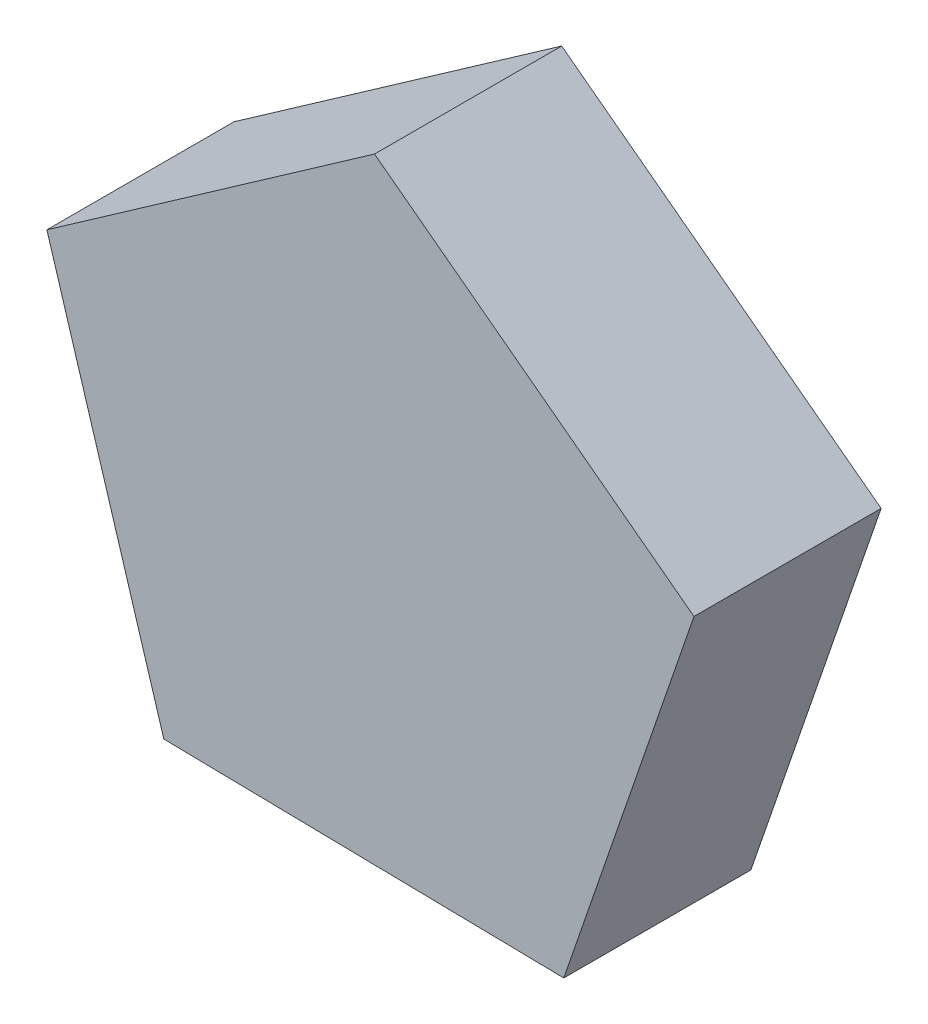
ISO-10303-21;
HEADER;
FILE_DESCRIPTION(('STEP AP214'),'2;1');
FILE_NAME('part.step','',(''),(''),'','','');
FILE_SCHEMA(('AUTOMOTIVE_DESIGN { 1 0 10303 214 1 1 1 1 }'));
ENDSEC;
DATA;
#1=APPLICATION_CONTEXT('core data for automotive mechanical design processes');
#2=APPLICATION_PROTOCOL_DEFINITION('international standard','automotive_design',2000,#1);
#3=PRODUCT_CONTEXT('',#1,'mechanical');
#4=PRODUCT('Part','Part','',(#3));
#5=PRODUCT_RELATED_PRODUCT_CATEGORY('part','',(#4));
#6=PRODUCT_DEFINITION_FORMATION('','',#4);
#7=PRODUCT_DEFINITION_CONTEXT('part definition',#1,'design');
#8=PRODUCT_DEFINITION('design','',#6,#7);
#9=PRODUCT_DEFINITION_SHAPE('','',#8);
#10=(LENGTH_UNIT() NAMED_UNIT(*) SI_UNIT(.MILLI.,.METRE.));
#11=(NAMED_UNIT(*) PLANE_ANGLE_UNIT() SI_UNIT($,.RADIAN.));
#12=(NAMED_UNIT(*) SI_UNIT($,.STERADIAN.) SOLID_ANGLE_UNIT());
#13=UNCERTAINTY_MEASURE_WITH_UNIT(LENGTH_MEASURE(1.E-05),#10,'distance_accuracy_value','');
#14=(GEOMETRIC_REPRESENTATION_CONTEXT(3) GLOBAL_UNCERTAINTY_ASSIGNED_CONTEXT((#13)) GLOBAL_UNIT_ASSIGNED_CONTEXT((#10,
#11,#12)) REPRESENTATION_CONTEXT('',''));
#15=CARTESIAN_POINT('',(0.,0.,0.));
#16=DIRECTION('',(0.,0.,1.));
#17=DIRECTION('',(1.,0.,0.));
#18=AXIS2_PLACEMENT_3D('',#15,#16,#17);
#19=CARTESIAN_POINT('',(23.4715287270209,0.616959114220165,11.));
#20=DIRECTION('',(-0.945518575599317,0.325568154457157,0.));
#21=DIRECTION('',(-0.325568154457157,-0.945518575599317,0.));
#22=AXIS2_PLACEMENT_3D('',#19,#20,#21);
#23=PLANE('',#22);
#24=DIRECTION('',(0.325568154457157,0.945518575599317,0.));
#25=VECTOR('',#24,1.);
#26=CARTESIAN_POINT('',(23.4715287270209,0.616959114220165,0.));
#27=LINE('',#26,#25);
#28=CARTESIAN_POINT('',(23.4715287270209,0.616959114220165,0.));
#29=VERTEX_POINT('',#28);
#30=CARTESIAN_POINT('',(31.1260951192607,22.8474340944547,0.));
#31=VERTEX_POINT('',#30);
#32=EDGE_CURVE('E115',#29,#31,#27,.T.);
#33=ORIENTED_EDGE('',*,*,#32,.T.);
#34=DIRECTION('',(0.,0.,-1.));
#35=VECTOR('',#34,1.);
#36=CARTESIAN_POINT('',(31.1260951192607,22.8474340944547,11.));
#37=LINE('',#36,#35);
#38=CARTESIAN_POINT('',(31.1260951192607,22.8474340944547,11.));
#39=VERTEX_POINT('',#38);
#40=EDGE_CURVE('E11',#39,#31,#37,.T.);
#41=ORIENTED_EDGE('',*,*,#40,.F.);
#42=DIRECTION('',(0.325568154457157,0.945518575599317,0.));
#43=VECTOR('',#42,1.);
#44=CARTESIAN_POINT('',(23.4715287270209,0.616959114220165,11.));
#45=LINE('',#44,#43);
#46=CARTESIAN_POINT('',(23.4715287270209,0.616959114220165,11.));
#47=VERTEX_POINT('',#46);
#48=EDGE_CURVE('E123',#47,#39,#45,.T.);
#49=ORIENTED_EDGE('',*,*,#48,.F.);
#50=DIRECTION('',(0.,0.,-1.));
#51=VECTOR('',#50,1.);
#52=CARTESIAN_POINT('',(23.4715287270209,0.616959114220165,11.));
#53=LINE('',#52,#51);
#54=EDGE_CURVE('E111',#47,#29,#53,.T.);
#55=ORIENTED_EDGE('',*,*,#54,.T.);
#56=EDGE_LOOP('',(#33,#41,#49,#55));
#57=FACE_BOUND('',#56,.T.);
#58=ADVANCED_FACE('F41',(#57),#23,.F.);
#59=CARTESIAN_POINT('',(31.1260951192607,22.8474340944547,11.));
#60=DIRECTION('',(-0.601815023152048,-0.798635510047293,0.));
#61=DIRECTION('',(0.798635510047293,-0.601815023152048,0.));
#62=AXIS2_PLACEMENT_3D('',#59,#60,#61);
#63=PLANE('',#62);
#64=DIRECTION('',(-0.798635510047293,0.601815023152048,0.));
#65=VECTOR('',#64,1.);
#66=CARTESIAN_POINT('',(31.1260951192607,22.8474340944547,0.));
#67=LINE('',#66,#65);
#68=CARTESIAN_POINT('',(12.3490481287457,36.9969539031278,0.));
#69=VERTEX_POINT('',#68);
#70=EDGE_CURVE('E118',#31,#69,#67,.T.);
#71=ORIENTED_EDGE('',*,*,#70,.T.);
#72=DIRECTION('',(0.,0.,-1.));
#73=VECTOR('',#72,1.);
#74=CARTESIAN_POINT('',(12.3490481287457,36.9969539031278,11.));
#75=LINE('',#74,#73);
#76=CARTESIAN_POINT('',(12.3490481287457,36.9969539031278,11.));
#77=VERTEX_POINT('',#76);
#78=EDGE_CURVE('E49',#77,#69,#75,.T.);
#79=ORIENTED_EDGE('',*,*,#78,.F.);
#80=DIRECTION('',(-0.798635510047293,0.601815023152048,0.));
#81=VECTOR('',#80,1.);
#82=CARTESIAN_POINT('',(31.1260951192607,22.8474340944547,11.));
#83=LINE('',#82,#81);
#84=EDGE_CURVE('E91',#39,#77,#83,.T.);
#85=ORIENTED_EDGE('',*,*,#84,.F.);
#86=ORIENTED_EDGE('',*,*,#40,.T.);
#87=EDGE_LOOP('',(#71,#79,#85,#86));
#88=FACE_BOUND('',#87,.T.);
#89=ADVANCED_FACE('F142',(#88),#63,.F.);
#90=CARTESIAN_POINT('',(12.3490481287457,36.9969539031278,11.));
#91=DIRECTION('',(0.573576436351046,-0.819152044288992,0.));
#92=DIRECTION('',(0.819152044288992,0.573576436351046,0.));
#93=AXIS2_PLACEMENT_3D('',#90,#91,#92);
#94=PLANE('',#93);
#95=DIRECTION('',(-0.819152044288992,-0.573576436351046,0.));
#96=VECTOR('',#95,1.);
#97=CARTESIAN_POINT('',(12.3490481287457,36.9969539031278,0.));
#98=LINE('',#97,#96);
#99=CARTESIAN_POINT('',(-6.91037151198633,23.5113630891431,0.));
#100=VERTEX_POINT('',#99);
#101=EDGE_CURVE('E106',#69,#100,#98,.T.);
#102=ORIENTED_EDGE('',*,*,#101,.T.);
#103=DIRECTION('',(0.,0.,-1.));
#104=VECTOR('',#103,1.);
#105=CARTESIAN_POINT('',(-6.91037151198633,23.5113630891431,11.));
#106=LINE('',#105,#104);
#107=CARTESIAN_POINT('',(-6.91037151198633,23.5113630891431,11.));
#108=VERTEX_POINT('',#107);
#109=EDGE_CURVE('E103',#108,#100,#106,.T.);
#110=ORIENTED_EDGE('',*,*,#109,.F.);
#111=DIRECTION('',(-0.819152044288992,-0.573576436351046,0.));
#112=VECTOR('',#111,1.);
#113=CARTESIAN_POINT('',(12.3490481287457,36.9969539031278,11.));
#114=LINE('',#113,#112);
#115=EDGE_CURVE('E95',#77,#108,#114,.T.);
#116=ORIENTED_EDGE('',*,*,#115,.F.);
#117=ORIENTED_EDGE('',*,*,#78,.T.);
#118=EDGE_LOOP('',(#102,#110,#116,#117));
#119=FACE_BOUND('',#118,.T.);
#120=ADVANCED_FACE('F104',(#119),#94,.F.);
#121=CARTESIAN_POINT('',(-6.91037151198633,23.5113630891431,11.));
#122=DIRECTION('',(0.956304755963036,0.292371704722737,0.));
#123=DIRECTION('',(-0.292371704722737,0.956304755963036,0.));
#124=AXIS2_PLACEMENT_3D('',#121,#122,#123);
#125=PLANE('',#124);
#126=DIRECTION('',(0.292371704722737,-0.956304755963035,0.));
#127=VECTOR('',#126,1.);
#128=CARTESIAN_POINT('',(-6.91037151198633,23.5113630891431,0.));
#129=LINE('',#128,#127);
#130=CARTESIAN_POINT('',(-0.0363004630409627,1.02728979905415,0.));
#131=VERTEX_POINT('',#130);
#132=EDGE_CURVE('E77',#100,#131,#129,.T.);
#133=ORIENTED_EDGE('',*,*,#132,.T.);
#134=DIRECTION('',(0.,0.,-1.));
#135=VECTOR('',#134,1.);
#136=CARTESIAN_POINT('',(-0.0363004630409627,1.02728979905415,11.));
#137=LINE('',#136,#135);
#138=CARTESIAN_POINT('',(-0.0363004630409627,1.02728979905415,11.));
#139=VERTEX_POINT('',#138);
#140=EDGE_CURVE('E107',#139,#131,#137,.T.);
#141=ORIENTED_EDGE('',*,*,#140,.F.);
#142=DIRECTION('',(0.292371704722737,-0.956304755963035,0.));
#143=VECTOR('',#142,1.);
#144=CARTESIAN_POINT('',(-6.91037151198633,23.5113630891431,11.));
#145=LINE('',#144,#143);
#146=EDGE_CURVE('E99',#108,#139,#145,.T.);
#147=ORIENTED_EDGE('',*,*,#146,.F.);
#148=ORIENTED_EDGE('',*,*,#109,.T.);
#149=EDGE_LOOP('',(#133,#141,#147,#148));
#150=FACE_BOUND('',#149,.T.);
#151=ADVANCED_FACE('F109',(#150),#125,.F.);
#152=CARTESIAN_POINT('',(-0.0363004630409627,1.02728979905415,11.));
#153=DIRECTION('',(0.0174524064372836,0.999847695156391,0.));
#154=DIRECTION('',(-0.999847695156391,0.0174524064372836,0.));
#155=AXIS2_PLACEMENT_3D('',#152,#153,#154);
#156=PLANE('',#155);
#157=DIRECTION('',(0.999847695156391,-0.0174524064372836,0.));
#158=VECTOR('',#157,1.);
#159=CARTESIAN_POINT('',(-0.0363004630409627,1.02728979905415,0.));
#160=LINE('',#159,#158);
#161=EDGE_CURVE('E83',#131,#29,#160,.T.);
#162=ORIENTED_EDGE('',*,*,#161,.T.);
#163=ORIENTED_EDGE('',*,*,#54,.F.);
#164=DIRECTION('',(0.999847695156391,-0.0174524064372836,0.));
#165=VECTOR('',#164,1.);
#166=CARTESIAN_POINT('',(-0.0363004630409627,1.02728979905415,11.));
#167=LINE('',#166,#165);
#168=EDGE_CURVE('E57',#139,#47,#167,.T.);
#169=ORIENTED_EDGE('',*,*,#168,.F.);
#170=ORIENTED_EDGE('',*,*,#140,.T.);
#171=EDGE_LOOP('',(#162,#163,#169,#170));
#172=FACE_BOUND('',#171,.T.);
#173=ADVANCED_FACE('F131',(#172),#156,.F.);
#174=CARTESIAN_POINT('',(0.,0.,11.));
#175=DIRECTION('',(0.,0.,1.));
#176=DIRECTION('',(1.,0.,0.));
#177=AXIS2_PLACEMENT_3D('',#174,#175,#176);
#178=PLANE('',#177);
#179=ORIENTED_EDGE('',*,*,#48,.T.);
#180=ORIENTED_EDGE('',*,*,#84,.T.);
#181=ORIENTED_EDGE('',*,*,#115,.T.);
#182=ORIENTED_EDGE('',*,*,#146,.T.);
#183=ORIENTED_EDGE('',*,*,#168,.T.);
#184=EDGE_LOOP('',(#179,#180,#181,#182,#183));
#185=FACE_BOUND('',#184,.T.);
#186=ADVANCED_FACE('F97',(#185),#178,.T.);
#187=CARTESIAN_POINT('',(0.,0.,0.));
#188=DIRECTION('',(0.,0.,1.));
#189=DIRECTION('',(1.,0.,0.));
#190=AXIS2_PLACEMENT_3D('',#187,#188,#189);
#191=PLANE('',#190);
#192=ORIENTED_EDGE('',*,*,#32,.F.);
#193=ORIENTED_EDGE('',*,*,#161,.F.);
#194=ORIENTED_EDGE('',*,*,#132,.F.);
#195=ORIENTED_EDGE('',*,*,#101,.F.);
#196=ORIENTED_EDGE('',*,*,#70,.F.);
#197=EDGE_LOOP('',(#192,#193,#194,#195,#196));
#198=FACE_BOUND('',#197,.T.);
#199=ADVANCED_FACE('F127',(#198),#191,.F.);
#200=CLOSED_SHELL('',(#58,#89,#120,#151,#173,#186,#199));
#201=MANIFOLD_SOLID_BREP('B2',#200);
#202=ADVANCED_BREP_SHAPE_REPRESENTATION('',(#18,#201),#14);
#203=SHAPE_DEFINITION_REPRESENTATION(#9,#202);
ENDSEC;
END-ISO-10303-21;
